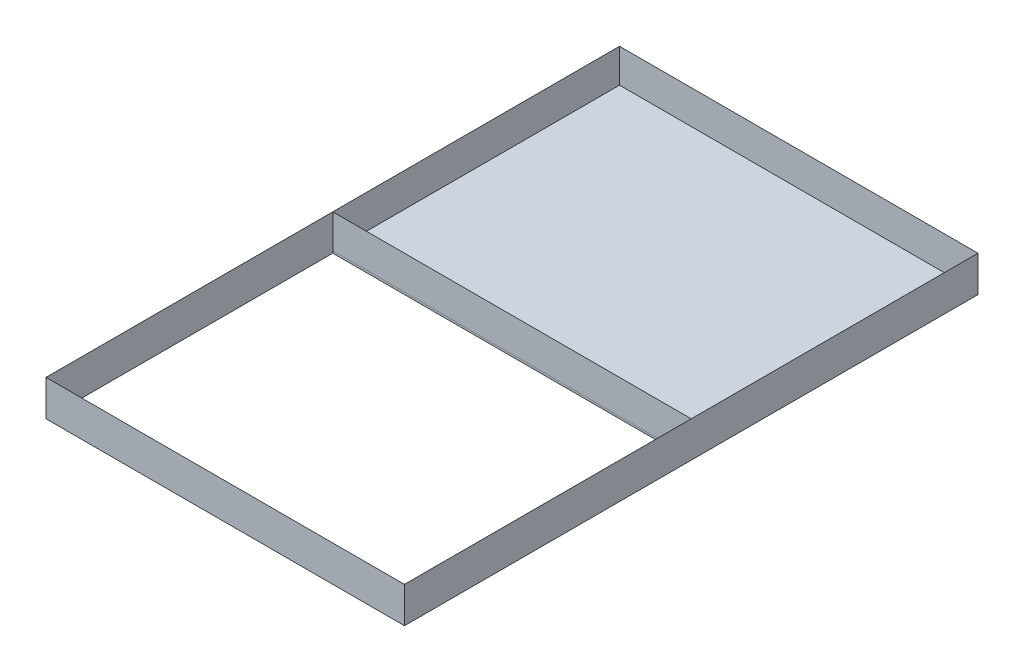
ISO-10303-21;
HEADER;
FILE_DESCRIPTION(('STEP AP214'),'2;1');
FILE_NAME('part.step','',(''),(''),'','','');
FILE_SCHEMA(('AUTOMOTIVE_DESIGN { 1 0 10303 214 1 1 1 1 }'));
ENDSEC;
DATA;
#1=APPLICATION_CONTEXT('core data for automotive mechanical design processes');
#2=APPLICATION_PROTOCOL_DEFINITION('international standard','automotive_design',2000,#1);
#3=PRODUCT_CONTEXT('',#1,'mechanical');
#4=PRODUCT('Part','Part','',(#3));
#5=PRODUCT_RELATED_PRODUCT_CATEGORY('part','',(#4));
#6=PRODUCT_DEFINITION_FORMATION('','',#4);
#7=PRODUCT_DEFINITION_CONTEXT('part definition',#1,'design');
#8=PRODUCT_DEFINITION('design','',#6,#7);
#9=PRODUCT_DEFINITION_SHAPE('','',#8);
#10=(LENGTH_UNIT() NAMED_UNIT(*) SI_UNIT(.MILLI.,.METRE.));
#11=(NAMED_UNIT(*) PLANE_ANGLE_UNIT() SI_UNIT($,.RADIAN.));
#12=(NAMED_UNIT(*) SI_UNIT($,.STERADIAN.) SOLID_ANGLE_UNIT());
#13=UNCERTAINTY_MEASURE_WITH_UNIT(LENGTH_MEASURE(1.E-05),#10,'distance_accuracy_value','');
#14=(GEOMETRIC_REPRESENTATION_CONTEXT(3) GLOBAL_UNCERTAINTY_ASSIGNED_CONTEXT((#13)) GLOBAL_UNIT_ASSIGNED_CONTEXT((#10,
#11,#12)) REPRESENTATION_CONTEXT('',''));
#15=CARTESIAN_POINT('',(0.,0.,0.));
#16=DIRECTION('',(0.,0.,1.));
#17=DIRECTION('',(1.,0.,0.));
#18=AXIS2_PLACEMENT_3D('',#15,#16,#17);
#19=CARTESIAN_POINT('',(63.5000000000001,-196.85,-660.4));
#20=DIRECTION('',(0.,0.,1.));
#21=DIRECTION('',(1.,0.,0.));
#22=AXIS2_PLACEMENT_3D('',#19,#20,#21);
#23=PLANE('',#22);
#24=DIRECTION('',(0.,1.,0.));
#25=VECTOR('',#24,1.);
#26=CARTESIAN_POINT('',(63.5000000000001,-196.85,-660.4));
#27=LINE('',#26,#25);
#28=CARTESIAN_POINT('',(63.5000000000001,-196.85,-660.4));
#29=VERTEX_POINT('',#28);
#30=CARTESIAN_POINT('',(63.5000000000001,-196.088,-660.4));
#31=VERTEX_POINT('',#30);
#32=EDGE_CURVE('E13',#29,#31,#27,.T.);
#33=ORIENTED_EDGE('',*,*,#32,.F.);
#34=DIRECTION('',(-1.,0.,0.));
#35=VECTOR('',#34,1.);
#36=CARTESIAN_POINT('',(-69.85,-196.85,-660.4));
#37=LINE('',#36,#35);
#38=CARTESIAN_POINT('',(-63.4999999999999,-196.85,-660.4));
#39=VERTEX_POINT('',#38);
#40=EDGE_CURVE('E98',#29,#39,#37,.T.);
#41=ORIENTED_EDGE('',*,*,#40,.T.);
#42=DIRECTION('',(0.,1.,0.));
#43=VECTOR('',#42,1.);
#44=CARTESIAN_POINT('',(-63.4999999999999,-196.85,-660.4));
#45=LINE('',#44,#43);
#46=CARTESIAN_POINT('',(-63.4999999999999,-196.088,-660.4));
#47=VERTEX_POINT('',#46);
#48=EDGE_CURVE('E63',#39,#47,#45,.T.);
#49=ORIENTED_EDGE('',*,*,#48,.T.);
#50=DIRECTION('',(-1.,0.,0.));
#51=VECTOR('',#50,1.);
#52=CARTESIAN_POINT('',(-69.85,-196.088,-660.4));
#53=LINE('',#52,#51);
#54=EDGE_CURVE('E123',#31,#47,#53,.T.);
#55=ORIENTED_EDGE('',*,*,#54,.F.);
#56=EDGE_LOOP('',(#33,#41,#49,#55));
#57=FACE_BOUND('',#56,.T.);
#58=ADVANCED_FACE('F55',(#57),#23,.F.);
#59=CARTESIAN_POINT('',(63.5000000000001,-196.85,-457.2));
#60=DIRECTION('',(-1.,0.,0.));
#61=DIRECTION('',(0.,0.,1.));
#62=AXIS2_PLACEMENT_3D('',#59,#60,#61);
#63=PLANE('',#62);
#64=DIRECTION('',(0.,1.,0.));
#65=VECTOR('',#64,1.);
#66=CARTESIAN_POINT('',(63.5000000000001,-196.85,-558.8));
#67=LINE('',#66,#65);
#68=CARTESIAN_POINT('',(63.5000000000001,-196.85,-558.8));
#69=VERTEX_POINT('',#68);
#70=CARTESIAN_POINT('',(63.5000000000001,-196.088,-558.8));
#71=VERTEX_POINT('',#70);
#72=EDGE_CURVE('E117',#69,#71,#67,.T.);
#73=ORIENTED_EDGE('',*,*,#72,.F.);
#74=DIRECTION('',(0.,0.,-1.));
#75=VECTOR('',#74,1.);
#76=CARTESIAN_POINT('',(63.5000000000002,-196.85,-883.4669125955));
#77=LINE('',#76,#75);
#78=EDGE_CURVE('E111',#69,#29,#77,.T.);
#79=ORIENTED_EDGE('',*,*,#78,.T.);
#80=ORIENTED_EDGE('',*,*,#32,.T.);
#81=DIRECTION('',(0.,0.,-1.));
#82=VECTOR('',#81,1.);
#83=CARTESIAN_POINT('',(63.5000000000002,-196.088,-883.4669125955));
#84=LINE('',#83,#82);
#85=EDGE_CURVE('E69',#71,#31,#84,.T.);
#86=ORIENTED_EDGE('',*,*,#85,.F.);
#87=EDGE_LOOP('',(#73,#79,#80,#86));
#88=FACE_BOUND('',#87,.T.);
#89=ADVANCED_FACE('F131',(#88),#63,.F.);
#90=CARTESIAN_POINT('',(-63.4999999999999,-196.85,-660.4));
#91=DIRECTION('',(1.,0.,0.));
#92=DIRECTION('',(0.,0.,-1.));
#93=AXIS2_PLACEMENT_3D('',#90,#91,#92);
#94=PLANE('',#93);
#95=ORIENTED_EDGE('',*,*,#48,.F.);
#96=DIRECTION('',(0.,0.,1.));
#97=VECTOR('',#96,1.);
#98=CARTESIAN_POINT('',(-63.4999999999999,-196.85,-883.4669125955));
#99=LINE('',#98,#97);
#100=CARTESIAN_POINT('',(-63.4999999999999,-196.85,-558.8));
#101=VERTEX_POINT('',#100);
#102=EDGE_CURVE('E103',#39,#101,#99,.T.);
#103=ORIENTED_EDGE('',*,*,#102,.T.);
#104=DIRECTION('',(0.,1.,0.));
#105=VECTOR('',#104,1.);
#106=CARTESIAN_POINT('',(-63.4999999999999,-196.85,-558.8));
#107=LINE('',#106,#105);
#108=CARTESIAN_POINT('',(-63.4999999999999,-196.088,-558.8));
#109=VERTEX_POINT('',#108);
#110=EDGE_CURVE('E113',#101,#109,#107,.T.);
#111=ORIENTED_EDGE('',*,*,#110,.T.);
#112=DIRECTION('',(0.,0.,1.));
#113=VECTOR('',#112,1.);
#114=CARTESIAN_POINT('',(-63.4999999999999,-196.088,-883.4669125955));
#115=LINE('',#114,#113);
#116=EDGE_CURVE('E77',#47,#109,#115,.T.);
#117=ORIENTED_EDGE('',*,*,#116,.F.);
#118=EDGE_LOOP('',(#95,#103,#111,#117));
#119=FACE_BOUND('',#118,.T.);
#120=ADVANCED_FACE('F57',(#119),#94,.F.);
#121=CARTESIAN_POINT('',(-63.4999999999999,-196.85,-558.8));
#122=DIRECTION('',(0.,0.,1.));
#123=DIRECTION('',(1.,0.,0.));
#124=AXIS2_PLACEMENT_3D('',#121,#122,#123);
#125=PLANE('',#124);
#126=ORIENTED_EDGE('',*,*,#72,.T.);
#127=DIRECTION('',(-1.,0.,0.));
#128=VECTOR('',#127,1.);
#129=CARTESIAN_POINT('',(-69.85,-196.088,-558.8));
#130=LINE('',#129,#128);
#131=EDGE_CURVE('E114',#71,#109,#130,.T.);
#132=ORIENTED_EDGE('',*,*,#131,.T.);
#133=ORIENTED_EDGE('',*,*,#110,.F.);
#134=DIRECTION('',(-1.,0.,0.));
#135=VECTOR('',#134,1.);
#136=CARTESIAN_POINT('',(-69.85,-196.85,-558.8));
#137=LINE('',#136,#135);
#138=EDGE_CURVE('E104',#69,#101,#137,.T.);
#139=ORIENTED_EDGE('',*,*,#138,.F.);
#140=EDGE_LOOP('',(#126,#132,#133,#139));
#141=FACE_BOUND('',#140,.T.);
#142=ADVANCED_FACE('F129',(#141),#125,.T.);
#143=CARTESIAN_POINT('',(-69.85,-196.088,-883.4669125955));
#144=DIRECTION('',(0.,-1.,0.));
#145=DIRECTION('',(0.,0.,-1.));
#146=AXIS2_PLACEMENT_3D('',#143,#144,#145);
#147=PLANE('',#146);
#148=ORIENTED_EDGE('',*,*,#85,.T.);
#149=ORIENTED_EDGE('',*,*,#54,.T.);
#150=ORIENTED_EDGE('',*,*,#116,.T.);
#151=ORIENTED_EDGE('',*,*,#131,.F.);
#152=EDGE_LOOP('',(#148,#149,#150,#151));
#153=FACE_BOUND('',#152,.T.);
#154=ADVANCED_FACE('F130',(#153),#147,.F.);
#155=CARTESIAN_POINT('',(-69.85,-196.85,-883.4669125955));
#156=DIRECTION('',(0.,-1.,0.));
#157=DIRECTION('',(0.,0.,-1.));
#158=AXIS2_PLACEMENT_3D('',#155,#156,#157);
#159=PLANE('',#158);
#160=ORIENTED_EDGE('',*,*,#40,.F.);
#161=ORIENTED_EDGE('',*,*,#78,.F.);
#162=ORIENTED_EDGE('',*,*,#138,.T.);
#163=ORIENTED_EDGE('',*,*,#102,.F.);
#164=EDGE_LOOP('',(#160,#161,#162,#163));
#165=FACE_BOUND('',#164,.T.);
#166=ADVANCED_FACE('F108',(#165),#159,.T.);
#167=CLOSED_SHELL('',(#58,#89,#120,#142,#154,#166));
#168=MANIFOLD_SOLID_BREP('B2',#167);
#169=CARTESIAN_POINT('',(-63.4999999999999,-196.85,-558.8));
#170=DIRECTION('',(0.,0.,1.));
#171=DIRECTION('',(1.,0.,0.));
#172=AXIS2_PLACEMENT_3D('',#169,#170,#171);
#173=PLANE('',#172);
#174=DIRECTION('',(1.,0.,0.));
#175=VECTOR('',#174,1.);
#176=CARTESIAN_POINT('',(-63.4999999999999,-184.15,-558.8));
#177=LINE('',#176,#175);
#178=CARTESIAN_POINT('',(-63.4999999999999,-184.15,-558.8));
#179=VERTEX_POINT('',#178);
#180=CARTESIAN_POINT('',(63.5000000000001,-184.15,-558.8));
#181=VERTEX_POINT('',#180);
#182=EDGE_CURVE('E217',#179,#181,#177,.T.);
#183=ORIENTED_EDGE('',*,*,#182,.F.);
#184=DIRECTION('',(0.,1.,0.));
#185=VECTOR('',#184,1.);
#186=CARTESIAN_POINT('',(-63.4999999999999,-196.85,-558.8));
#187=LINE('',#186,#185);
#188=CARTESIAN_POINT('',(-63.4999999999999,-196.85,-558.8));
#189=VERTEX_POINT('',#188);
#190=EDGE_CURVE('E199',#189,#179,#187,.T.);
#191=ORIENTED_EDGE('',*,*,#190,.F.);
#192=DIRECTION('',(1.,0.,0.));
#193=VECTOR('',#192,1.);
#194=CARTESIAN_POINT('',(-63.4999999999999,-196.85,-558.8));
#195=LINE('',#194,#193);
#196=CARTESIAN_POINT('',(63.5000000000001,-196.85,-558.8));
#197=VERTEX_POINT('',#196);
#198=EDGE_CURVE('E205',#189,#197,#195,.T.);
#199=ORIENTED_EDGE('',*,*,#198,.T.);
#200=DIRECTION('',(0.,1.,0.));
#201=VECTOR('',#200,1.);
#202=CARTESIAN_POINT('',(63.5000000000001,-196.85,-558.8));
#203=LINE('',#202,#201);
#204=EDGE_CURVE('E53',#197,#181,#203,.T.);
#205=ORIENTED_EDGE('',*,*,#204,.T.);
#206=EDGE_LOOP('',(#183,#191,#199,#205));
#207=FACE_BOUND('',#206,.T.);
#208=ADVANCED_FACE('F198',(#207),#173,.T.);
#209=OPEN_SHELL('',(#208));
#210=SHELL_BASED_SURFACE_MODEL('B7',(#209));
#211=CARTESIAN_POINT('',(-63.4999999999999,-196.85,-660.4));
#212=DIRECTION('',(1.,0.,0.));
#213=DIRECTION('',(0.,0.,-1.));
#214=AXIS2_PLACEMENT_3D('',#211,#212,#213);
#215=PLANE('',#214);
#216=DIRECTION('',(0.,0.,-1.));
#217=VECTOR('',#216,1.);
#218=CARTESIAN_POINT('',(-63.4999999999999,-184.15,-660.4));
#219=LINE('',#218,#217);
#220=CARTESIAN_POINT('',(-63.4999999999999,-184.15,-457.2));
#221=VERTEX_POINT('',#220);
#222=CARTESIAN_POINT('',(-63.4999999999999,-184.15,-660.4));
#223=VERTEX_POINT('',#222);
#224=EDGE_CURVE('E250',#221,#223,#219,.T.);
#225=ORIENTED_EDGE('',*,*,#224,.F.);
#226=DIRECTION('',(0.,1.,0.));
#227=VECTOR('',#226,1.);
#228=CARTESIAN_POINT('',(-63.4999999999999,-196.85,-457.2));
#229=LINE('',#228,#227);
#230=CARTESIAN_POINT('',(-63.4999999999999,-196.85,-457.2));
#231=VERTEX_POINT('',#230);
#232=EDGE_CURVE('E258',#231,#221,#229,.T.);
#233=ORIENTED_EDGE('',*,*,#232,.F.);
#234=DIRECTION('',(0.,0.,-1.));
#235=VECTOR('',#234,1.);
#236=CARTESIAN_POINT('',(-63.4999999999999,-196.85,-660.4));
#237=LINE('',#236,#235);
#238=CARTESIAN_POINT('',(-63.4999999999999,-196.85,-660.4));
#239=VERTEX_POINT('',#238);
#240=EDGE_CURVE('E196',#231,#239,#237,.T.);
#241=ORIENTED_EDGE('',*,*,#240,.T.);
#242=DIRECTION('',(0.,1.,0.));
#243=VECTOR('',#242,1.);
#244=CARTESIAN_POINT('',(-63.4999999999999,-196.85,-660.4));
#245=LINE('',#244,#243);
#246=EDGE_CURVE('E287',#239,#223,#245,.T.);
#247=ORIENTED_EDGE('',*,*,#246,.T.);
#248=EDGE_LOOP('',(#225,#233,#241,#247));
#249=FACE_BOUND('',#248,.T.);
#250=ADVANCED_FACE('F242',(#249),#215,.T.);
#251=CARTESIAN_POINT('',(63.5000000000001,-196.85,-660.4));
#252=DIRECTION('',(0.,0.,1.));
#253=DIRECTION('',(1.,0.,0.));
#254=AXIS2_PLACEMENT_3D('',#251,#252,#253);
#255=PLANE('',#254);
#256=DIRECTION('',(1.,0.,0.));
#257=VECTOR('',#256,1.);
#258=CARTESIAN_POINT('',(63.5000000000001,-184.15,-660.4));
#259=LINE('',#258,#257);
#260=CARTESIAN_POINT('',(63.5000000000001,-184.15,-660.4));
#261=VERTEX_POINT('',#260);
#262=EDGE_CURVE('E292',#223,#261,#259,.T.);
#263=ORIENTED_EDGE('',*,*,#262,.F.);
#264=ORIENTED_EDGE('',*,*,#246,.F.);
#265=DIRECTION('',(1.,0.,0.));
#266=VECTOR('',#265,1.);
#267=CARTESIAN_POINT('',(63.5000000000001,-196.85,-660.4));
#268=LINE('',#267,#266);
#269=CARTESIAN_POINT('',(63.5000000000001,-196.85,-660.4));
#270=VERTEX_POINT('',#269);
#271=EDGE_CURVE('E290',#239,#270,#268,.T.);
#272=ORIENTED_EDGE('',*,*,#271,.T.);
#273=DIRECTION('',(0.,1.,0.));
#274=VECTOR('',#273,1.);
#275=CARTESIAN_POINT('',(63.5000000000001,-196.85,-660.4));
#276=LINE('',#275,#274);
#277=EDGE_CURVE('E244',#270,#261,#276,.T.);
#278=ORIENTED_EDGE('',*,*,#277,.T.);
#279=EDGE_LOOP('',(#263,#264,#272,#278));
#280=FACE_BOUND('',#279,.T.);
#281=ADVANCED_FACE('F289',(#280),#255,.T.);
#282=CARTESIAN_POINT('',(63.5000000000001,-196.85,-457.2));
#283=DIRECTION('',(-1.,0.,0.));
#284=DIRECTION('',(0.,0.,1.));
#285=AXIS2_PLACEMENT_3D('',#282,#283,#284);
#286=PLANE('',#285);
#287=DIRECTION('',(0.,0.,1.));
#288=VECTOR('',#287,1.);
#289=CARTESIAN_POINT('',(63.5000000000001,-184.15,-457.2));
#290=LINE('',#289,#288);
#291=CARTESIAN_POINT('',(63.5000000000001,-184.15,-457.2));
#292=VERTEX_POINT('',#291);
#293=EDGE_CURVE('E316',#261,#292,#290,.T.);
#294=ORIENTED_EDGE('',*,*,#293,.F.);
#295=ORIENTED_EDGE('',*,*,#277,.F.);
#296=DIRECTION('',(0.,0.,1.));
#297=VECTOR('',#296,1.);
#298=CARTESIAN_POINT('',(63.5000000000001,-196.85,-457.2));
#299=LINE('',#298,#297);
#300=CARTESIAN_POINT('',(63.5000000000001,-196.85,-457.2));
#301=VERTEX_POINT('',#300);
#302=EDGE_CURVE('E323',#270,#301,#299,.T.);
#303=ORIENTED_EDGE('',*,*,#302,.T.);
#304=DIRECTION('',(0.,1.,0.));
#305=VECTOR('',#304,1.);
#306=CARTESIAN_POINT('',(63.5000000000001,-196.85,-457.2));
#307=LINE('',#306,#305);
#308=EDGE_CURVE('E275',#301,#292,#307,.T.);
#309=ORIENTED_EDGE('',*,*,#308,.T.);
#310=EDGE_LOOP('',(#294,#295,#303,#309));
#311=FACE_BOUND('',#310,.T.);
#312=ADVANCED_FACE('F301',(#311),#286,.T.);
#313=CARTESIAN_POINT('',(-63.4999999999999,-196.85,-457.2));
#314=DIRECTION('',(0.,0.,-1.));
#315=DIRECTION('',(-1.,0.,0.));
#316=AXIS2_PLACEMENT_3D('',#313,#314,#315);
#317=PLANE('',#316);
#318=DIRECTION('',(-1.,0.,0.));
#319=VECTOR('',#318,1.);
#320=CARTESIAN_POINT('',(-63.4999999999999,-184.15,-457.2));
#321=LINE('',#320,#319);
#322=EDGE_CURVE('E311',#292,#221,#321,.T.);
#323=ORIENTED_EDGE('',*,*,#322,.F.);
#324=ORIENTED_EDGE('',*,*,#308,.F.);
#325=DIRECTION('',(-1.,0.,0.));
#326=VECTOR('',#325,1.);
#327=CARTESIAN_POINT('',(-63.4999999999999,-196.85,-457.2));
#328=LINE('',#327,#326);
#329=EDGE_CURVE('E324',#301,#231,#328,.T.);
#330=ORIENTED_EDGE('',*,*,#329,.T.);
#331=ORIENTED_EDGE('',*,*,#232,.T.);
#332=EDGE_LOOP('',(#323,#324,#330,#331));
#333=FACE_BOUND('',#332,.T.);
#334=ADVANCED_FACE('F305',(#333),#317,.T.);
#335=OPEN_SHELL('',(#250,#281,#312,#334));
#336=SHELL_BASED_SURFACE_MODEL('B47',(#335));
#337=ADVANCED_BREP_SHAPE_REPRESENTATION('',(#18,#168),#14);
#338=MANIFOLD_SURFACE_SHAPE_REPRESENTATION('',(#18,#210,#336),#14);
#339=SHAPE_REPRESENTATION('',(#18),#14);
#340=SHAPE_DEFINITION_REPRESENTATION(#9,#339);
#341=SHAPE_REPRESENTATION_RELATIONSHIP('','',#339,#337);
#342=SHAPE_REPRESENTATION_RELATIONSHIP('','',#339,#338);
ENDSEC;
END-ISO-10303-21;
